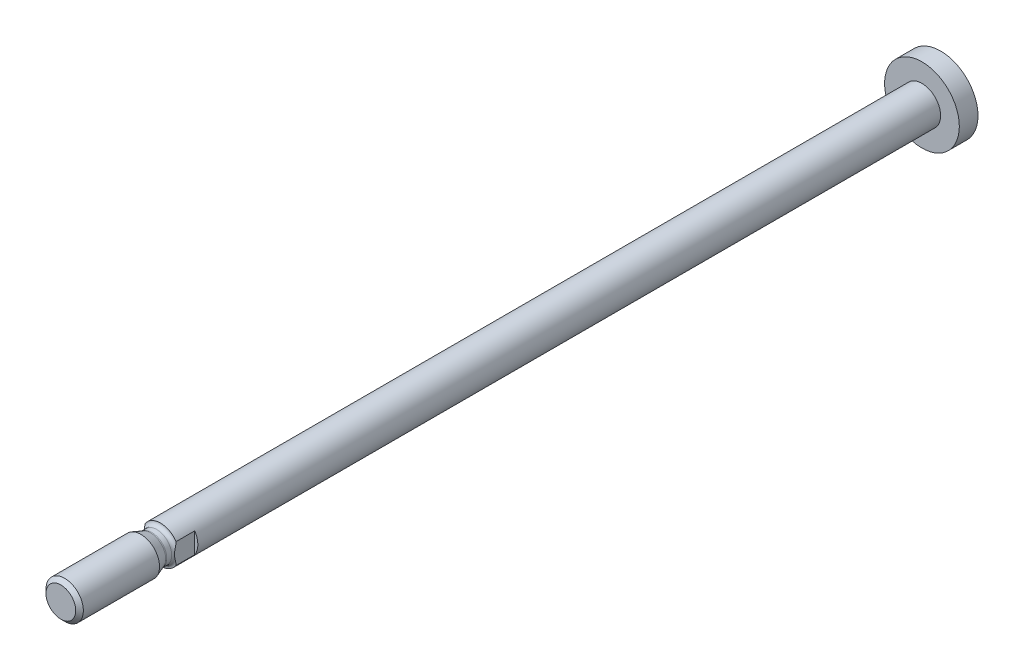
ISO-10303-21;
HEADER;
FILE_DESCRIPTION(('STEP AP214'),'2;1');
FILE_NAME('part.step','',(''),(''),'','','');
FILE_SCHEMA(('AUTOMOTIVE_DESIGN { 1 0 10303 214 1 1 1 1 }'));
ENDSEC;
DATA;
#1=APPLICATION_CONTEXT('core data for automotive mechanical design processes');
#2=APPLICATION_PROTOCOL_DEFINITION('international standard','automotive_design',2000,#1);
#3=PRODUCT_CONTEXT('',#1,'mechanical');
#4=PRODUCT('Part','Part','',(#3));
#5=PRODUCT_RELATED_PRODUCT_CATEGORY('part','',(#4));
#6=PRODUCT_DEFINITION_FORMATION('','',#4);
#7=PRODUCT_DEFINITION_CONTEXT('part definition',#1,'design');
#8=PRODUCT_DEFINITION('design','',#6,#7);
#9=PRODUCT_DEFINITION_SHAPE('','',#8);
#10=(LENGTH_UNIT() NAMED_UNIT(*) SI_UNIT(.MILLI.,.METRE.));
#11=(NAMED_UNIT(*) PLANE_ANGLE_UNIT() SI_UNIT($,.RADIAN.));
#12=(NAMED_UNIT(*) SI_UNIT($,.STERADIAN.) SOLID_ANGLE_UNIT());
#13=UNCERTAINTY_MEASURE_WITH_UNIT(LENGTH_MEASURE(1.E-05),#10,'distance_accuracy_value','');
#14=(GEOMETRIC_REPRESENTATION_CONTEXT(3) GLOBAL_UNCERTAINTY_ASSIGNED_CONTEXT((#13)) GLOBAL_UNIT_ASSIGNED_CONTEXT((#10,
#11,#12)) REPRESENTATION_CONTEXT('',''));
#15=CARTESIAN_POINT('',(0.,0.,0.));
#16=DIRECTION('',(0.,0.,1.));
#17=DIRECTION('',(1.,0.,0.));
#18=AXIS2_PLACEMENT_3D('',#15,#16,#17);
#19=CARTESIAN_POINT('',(0.,0.,-120.3));
#20=DIRECTION('',(0.,0.,1.));
#21=DIRECTION('',(1.,0.,0.));
#22=AXIS2_PLACEMENT_3D('',#19,#20,#21);
#23=CYLINDRICAL_SURFACE('',#22,3.);
#24=CARTESIAN_POINT('',(0.,0.,-117.3));
#25=DIRECTION('',(0.,0.,1.));
#26=DIRECTION('',(1.,0.,0.));
#27=AXIS2_PLACEMENT_3D('',#24,#25,#26);
#28=CIRCLE('',#27,3.);
#29=CARTESIAN_POINT('',(3.,0.,-117.3));
#30=VERTEX_POINT('',#29);
#31=EDGE_CURVE('E129',#30,#30,#28,.T.);
#32=ORIENTED_EDGE('',*,*,#31,.T.);
#33=EDGE_LOOP('',(#32));
#34=FACE_BOUND('',#33,.T.);
#35=DIRECTION('',(0.,0.,1.));
#36=VECTOR('',#35,1.);
#37=CARTESIAN_POINT('',(-2.5,-1.6583123951777,-120.3));
#38=LINE('',#37,#36);
#39=CARTESIAN_POINT('',(-2.5,-1.6583123951777,2.));
#40=VERTEX_POINT('',#39);
#41=CARTESIAN_POINT('',(-2.5,-1.6583123951777,4.99999999999999));
#42=VERTEX_POINT('',#41);
#43=EDGE_CURVE('E59',#40,#42,#38,.T.);
#44=ORIENTED_EDGE('',*,*,#43,.F.);
#45=CARTESIAN_POINT('',(0.,0.,2.));
#46=DIRECTION('',(0.,0.,1.));
#47=DIRECTION('',(1.,0.,0.));
#48=AXIS2_PLACEMENT_3D('',#45,#46,#47);
#49=CIRCLE('',#48,3.);
#50=CARTESIAN_POINT('',(-2.5,1.6583123951777,2.));
#51=VERTEX_POINT('',#50);
#52=EDGE_CURVE('E11',#51,#40,#49,.T.);
#53=ORIENTED_EDGE('',*,*,#52,.F.);
#54=DIRECTION('',(0.,0.,1.));
#55=VECTOR('',#54,1.);
#56=CARTESIAN_POINT('',(-2.5,1.6583123951777,-120.3));
#57=LINE('',#56,#55);
#58=CARTESIAN_POINT('',(-2.5,1.65831239517778,4.99999999999909));
#59=VERTEX_POINT('',#58);
#60=EDGE_CURVE('E99',#59,#51,#57,.F.);
#61=ORIENTED_EDGE('',*,*,#60,.F.);
#62=CARTESIAN_POINT('',(0.,0.,4.99999999999999));
#63=DIRECTION('',(0.,0.,1.));
#64=DIRECTION('',(1.,0.,0.));
#65=AXIS2_PLACEMENT_3D('',#62,#63,#64);
#66=CIRCLE('',#65,3.);
#67=CARTESIAN_POINT('',(2.5,1.6583123951777,4.99999999999999));
#68=VERTEX_POINT('',#67);
#69=EDGE_CURVE('E98',#68,#59,#66,.T.);
#70=ORIENTED_EDGE('',*,*,#69,.F.);
#71=DIRECTION('',(0.,0.,1.));
#72=VECTOR('',#71,1.);
#73=CARTESIAN_POINT('',(2.5,1.6583123951777,-120.3));
#74=LINE('',#73,#72);
#75=CARTESIAN_POINT('',(2.5,1.6583123951777,2.));
#76=VERTEX_POINT('',#75);
#77=EDGE_CURVE('E67',#76,#68,#74,.T.);
#78=ORIENTED_EDGE('',*,*,#77,.F.);
#79=CARTESIAN_POINT('',(2.5,-1.6583123951777,2.));
#80=VERTEX_POINT('',#79);
#81=EDGE_CURVE('E48',#80,#76,#49,.T.);
#82=ORIENTED_EDGE('',*,*,#81,.F.);
#83=DIRECTION('',(0.,0.,1.));
#84=VECTOR('',#83,1.);
#85=CARTESIAN_POINT('',(2.5,-1.6583123951777,-120.3));
#86=LINE('',#85,#84);
#87=CARTESIAN_POINT('',(2.5,-1.65831239517778,4.99999999999909));
#88=VERTEX_POINT('',#87);
#89=EDGE_CURVE('E92',#88,#80,#86,.F.);
#90=ORIENTED_EDGE('',*,*,#89,.F.);
#91=EDGE_CURVE('E132',#42,#88,#66,.T.);
#92=ORIENTED_EDGE('',*,*,#91,.F.);
#93=EDGE_LOOP('',(#44,#53,#61,#70,#78,#82,#90,#92));
#94=FACE_BOUND('',#93,.T.);
#95=ADVANCED_FACE('F45',(#34,#94),#23,.T.);
#96=CARTESIAN_POINT('',(0.,0.,5.6000000000001));
#97=DIRECTION('',(0.,0.,1.));
#98=DIRECTION('',(1.,0.,0.));
#99=AXIS2_PLACEMENT_3D('',#96,#97,#98);
#100=TOROIDAL_SURFACE('',#99,3.0000000000001,0.600000000000099);
#101=CARTESIAN_POINT('',(0.,0.,5.6));
#102=DIRECTION('',(0.,0.,1.));
#103=DIRECTION('',(1.,0.,0.));
#104=AXIS2_PLACEMENT_3D('',#101,#102,#103);
#105=CIRCLE('',#104,2.4);
#106=CARTESIAN_POINT('',(2.4,0.,5.6));
#107=VERTEX_POINT('',#106);
#108=EDGE_CURVE('E120',#107,#107,#105,.T.);
#109=ORIENTED_EDGE('',*,*,#108,.F.);
#110=EDGE_LOOP('',(#109));
#111=FACE_BOUND('',#110,.T.);
#112=CARTESIAN_POINT('',(-2.5,0.,5.26833752096453));
#113=CARTESIAN_POINT('',(-2.5,0.0507234426297441,5.26834839993848));
#114=CARTESIAN_POINT('',(-2.5,0.101441776799662,5.26596843791489));
#115=CARTESIAN_POINT('',(-2.5,0.202536067556288,5.2569952015163));
#116=CARTESIAN_POINT('',(-2.5,0.252911588949165,5.2503973212644));
#117=CARTESIAN_POINT('',(-2.5,0.35392632203634,5.23403658213965));
#118=CARTESIAN_POINT('',(-2.5,0.404557369480025,5.224225913585));
#119=CARTESIAN_POINT('',(-2.5,0.505400398866161,5.20278595137819));
#120=CARTESIAN_POINT('',(-2.5,0.555612509775304,5.1911572409283));
#121=CARTESIAN_POINT('',(-2.5,0.655655613826413,5.16721678219831));
#122=CARTESIAN_POINT('',(-2.5,0.705487327239528,5.15490798008948));
#123=CARTESIAN_POINT('',(-2.5,0.805181864056362,5.13041893752706));
#124=CARTESIAN_POINT('',(-2.5,0.855044688832192,5.11823870324147));
#125=CARTESIAN_POINT('',(-2.5,1.00507376125951,5.08293674920261));
#126=CARTESIAN_POINT('',(-2.5,1.1055660279648,5.06108488117838));
#127=CARTESIAN_POINT('',(-2.5,1.30645493621981,5.02592717471424));
#128=CARTESIAN_POINT('',(-2.5,1.40682678389803,5.01248870030289));
#129=CARTESIAN_POINT('',(-2.5,1.60840199518987,4.99838763017595));
#130=CARTESIAN_POINT('',(-2.5,1.70960094347028,4.99767823287719));
#131=CARTESIAN_POINT('',(-2.5,1.86622781794818,5.01106448653587));
#132=CARTESIAN_POINT('',(-2.5,1.92218137883188,5.01877622049858));
#133=CARTESIAN_POINT('',(-2.5,2.03285053262341,5.0413651074687));
#134=CARTESIAN_POINT('',(-2.5,2.08756307823151,5.05625824117348));
#135=CARTESIAN_POINT('',(-2.5,2.18328084843635,5.09083457513036));
#136=CARTESIAN_POINT('',(-2.5,2.22483950461237,5.10896465354793));
#137=CARTESIAN_POINT('',(-2.5,2.30459524648064,5.1515245306446));
#138=CARTESIAN_POINT('',(-2.5,2.34279989724468,5.17593963670877));
#139=CARTESIAN_POINT('',(-2.5,2.40362753966407,5.22361594487622));
#140=CARTESIAN_POINT('',(-2.5,2.42757076392253,5.24518752529637));
#141=CARTESIAN_POINT('',(-2.5,2.47175757689057,5.29185573262645));
#142=CARTESIAN_POINT('',(-2.5,2.49200531158724,5.31694835263777));
#143=CARTESIAN_POINT('',(-2.5,2.52468492158815,5.36594738678137));
#144=CARTESIAN_POINT('',(-2.5,2.53785643218482,5.38935828111803));
#145=CARTESIAN_POINT('',(-2.5,2.56013164913301,5.43805384411947));
#146=CARTESIAN_POINT('',(-2.5,2.56923737677398,5.46333757440499));
#147=CARTESIAN_POINT('',(-2.5,2.58283057049981,5.51527496834575));
#148=CARTESIAN_POINT('',(-2.5,2.58729356105886,5.54193512227162));
#149=CARTESIAN_POINT('',(-2.5,2.59118020467599,5.59561989324821));
#150=CARTESIAN_POINT('',(-2.5,2.5906054179438,5.62264439487102));
#151=CARTESIAN_POINT('',(-2.5,2.5847447911938,5.67371298536964));
#152=CARTESIAN_POINT('',(-2.5,2.57988467167735,5.69780754958458));
#153=CARTESIAN_POINT('',(-2.5,2.56633022368149,5.74488485425705));
#154=CARTESIAN_POINT('',(-2.5,2.55763543991684,5.76786746233366));
#155=CARTESIAN_POINT('',(-2.5,2.53647695281551,5.81308697753744));
#156=CARTESIAN_POINT('',(-2.5,2.52388217742275,5.83526203314746));
#157=CARTESIAN_POINT('',(-2.5,2.49565831542702,5.87756858678122));
#158=CARTESIAN_POINT('',(-2.5,2.4800283022487,5.897699457906));
#159=CARTESIAN_POINT('',(-2.5,2.4381803160609,5.94494905141413));
#160=CARTESIAN_POINT('',(-2.5,2.41048793322772,5.97076525046522));
#161=CARTESIAN_POINT('',(-2.5,2.35128940318857,6.01762864695372));
#162=CARTESIAN_POINT('',(-2.5,2.31977194494069,6.03866114436212));
#163=CARTESIAN_POINT('',(-2.5,2.23952256294481,6.08463351159361));
#164=CARTESIAN_POINT('',(-2.5,2.18939204577726,6.10711912432076));
#165=CARTESIAN_POINT('',(-2.5,2.086424206848,6.14398267826286));
#166=CARTESIAN_POINT('',(-2.5,2.03358928965091,6.15836768991921));
#167=CARTESIAN_POINT('',(-2.5,1.93599580204544,6.17849484994285));
#168=CARTESIAN_POINT('',(-2.5,1.89144834077192,6.18531116329585));
#169=CARTESIAN_POINT('',(-2.5,1.80189908033616,6.19505697557448));
#170=CARTESIAN_POINT('',(-2.5,1.75689686177072,6.19798247787778));
#171=CARTESIAN_POINT('',(-2.5,1.66646832286127,6.20053377831371));
#172=CARTESIAN_POINT('',(-2.5,1.6210413945456,6.20013412759755));
#173=CARTESIAN_POINT('',(-2.5,1.53034280767568,6.19650595241103));
#174=CARTESIAN_POINT('',(-2.5,1.48507106445849,6.1932793543307));
#175=CARTESIAN_POINT('',(-2.5,1.33918047559004,6.17906735223514));
#176=CARTESIAN_POINT('',(-2.5,1.23902345631669,6.16342028964884));
#177=CARTESIAN_POINT('',(-2.5,1.03994836030368,6.12508984420092));
#178=CARTESIAN_POINT('',(-2.5,0.941034235224376,6.10238806221333));
#179=CARTESIAN_POINT('',(-2.5,0.793509038998567,6.06677672186832));
#180=CARTESIAN_POINT('',(-2.5,0.7446863854637,6.054702575567));
#181=CARTESIAN_POINT('',(-2.5,0.646996290398524,6.030738686552));
#182=CARTESIAN_POINT('',(-2.5,0.598128851070118,6.0188489352388));
#183=CARTESIAN_POINT('',(-2.5,0.500334281886721,5.99617397742217));
#184=CARTESIAN_POINT('',(-2.5,0.451408146263369,5.98538460255591));
#185=CARTESIAN_POINT('',(-2.5,0.353119090508098,5.96594052833405));
#186=CARTESIAN_POINT('',(-2.5,0.303756196305667,5.95728570312374));
#187=CARTESIAN_POINT('',(-2.5,0.204122497966492,5.94328110899502));
#188=CARTESIAN_POINT('',(-2.5,0.153847567097064,5.93795905985694));
#189=CARTESIAN_POINT('',(-2.5,0.0530351286873156,5.93177082830429));
#190=CARTESIAN_POINT('',(-2.5,0.0024977994589948,5.930901937583));
#191=CARTESIAN_POINT('',(-2.5,-0.0985305210715612,5.93381110626722));
#192=CARTESIAN_POINT('',(-2.5,-0.14902123482016,5.93759813511376));
#193=CARTESIAN_POINT('',(-2.5,-0.249573888409545,5.94904126176878));
#194=CARTESIAN_POINT('',(-2.5,-0.299635458091892,5.95670041313862));
#195=CARTESIAN_POINT('',(-2.5,-0.399725252919972,5.97472154484855));
#196=CARTESIAN_POINT('',(-2.5,-0.449748880216866,5.98510788708088));
#197=CARTESIAN_POINT('',(-2.5,-0.549453617514231,6.00732659888942));
#198=CARTESIAN_POINT('',(-2.5,-0.599134785603654,6.01915871651809));
#199=CARTESIAN_POINT('',(-2.5,-0.698392421521691,6.04328051823731));
#200=CARTESIAN_POINT('',(-2.5,-0.747968869022546,6.05557028383309));
#201=CARTESIAN_POINT('',(-2.5,-0.84720464589227,6.07981009984425));
#202=CARTESIAN_POINT('',(-2.5,-0.896863971124109,6.0917601667094));
#203=CARTESIAN_POINT('',(-2.5,-0.975241469303783,6.10978478042876));
#204=CARTESIAN_POINT('',(-2.5,-1.00388150216564,6.11619624816889));
#205=CARTESIAN_POINT('',(-2.5,-1.06125902675178,6.12857195456169));
#206=CARTESIAN_POINT('',(-2.5,-1.08999652018277,6.13453618533974));
#207=CARTESIAN_POINT('',(-2.5,-1.14748265723325,6.1458846074232));
#208=CARTESIAN_POINT('',(-2.5,-1.17623091126653,6.15127075206469));
#209=CARTESIAN_POINT('',(-2.5,-1.23384312688132,6.16137594760793));
#210=CARTESIAN_POINT('',(-2.5,-1.26270708577413,6.16609501391968));
#211=CARTESIAN_POINT('',(-2.5,-1.34949136584038,6.17908804539659));
#212=CARTESIAN_POINT('',(-2.5,-1.40759592627029,6.18619616796949));
#213=CARTESIAN_POINT('',(-2.5,-1.52420669712544,6.19636423685649));
#214=CARTESIAN_POINT('',(-2.5,-1.58271310503325,6.1994220245478));
#215=CARTESIAN_POINT('',(-2.5,-1.70911532678372,6.20051114496721));
#216=CARTESIAN_POINT('',(-2.5,-1.77702602049488,6.19766666103081));
#217=CARTESIAN_POINT('',(-2.5,-1.912149147007,6.18315262249392));
#218=CARTESIAN_POINT('',(-2.5,-1.97936016975703,6.17146782027944));
#219=CARTESIAN_POINT('',(-2.5,-2.09293467910467,6.14162835403314));
#220=CARTESIAN_POINT('',(-2.5,-2.1399801193776,6.12611102431254));
#221=CARTESIAN_POINT('',(-2.5,-2.23116163556241,6.08815370009842));
#222=CARTESIAN_POINT('',(-2.5,-2.27530548479003,6.06573319994486));
#223=CARTESIAN_POINT('',(-2.5,-2.34660579555824,6.0206656653127));
#224=CARTESIAN_POINT('',(-2.5,-2.37498330055351,5.99995880382842));
#225=CARTESIAN_POINT('',(-2.5,-2.42818185419372,5.95435228802646));
#226=CARTESIAN_POINT('',(-2.5,-2.45300628498281,5.92945667074117));
#227=CARTESIAN_POINT('',(-2.5,-2.49337206402375,5.88080957286876));
#228=CARTESIAN_POINT('',(-2.5,-2.50977972671913,5.85778028891266));
#229=CARTESIAN_POINT('',(-2.5,-2.5385948801776,5.80932543735906));
#230=CARTESIAN_POINT('',(-2.5,-2.55100468980703,5.7839012699618));
#231=CARTESIAN_POINT('',(-2.5,-2.57111606880391,5.7310152189761));
#232=CARTESIAN_POINT('',(-2.5,-2.57878240755407,5.70353974708557));
#233=CARTESIAN_POINT('',(-2.5,-2.58865812747843,5.64762323062993));
#234=CARTESIAN_POINT('',(-2.5,-2.59087093912576,5.61918280447873));
#235=CARTESIAN_POINT('',(-2.5,-2.58974032110845,5.56589468768046));
#236=CARTESIAN_POINT('',(-2.5,-2.58704036062141,5.54103102121321));
#237=CARTESIAN_POINT('',(-2.5,-2.57748265423562,5.49212434637714));
#238=CARTESIAN_POINT('',(-2.5,-2.57062518368025,5.46808128377277));
#239=CARTESIAN_POINT('',(-2.5,-2.55318309970271,5.42147694109437));
#240=CARTESIAN_POINT('',(-2.5,-2.54260847384664,5.39891188066154));
#241=CARTESIAN_POINT('',(-2.5,-2.51826231502416,5.35558968714916));
#242=CARTESIAN_POINT('',(-2.5,-2.50448933519591,5.33483337816906));
#243=CARTESIAN_POINT('',(-2.5,-2.46797257111134,5.28708275256527));
#244=CARTESIAN_POINT('',(-2.5,-2.44388663659998,5.26111270404154));
#245=CARTESIAN_POINT('',(-2.5,-2.39183121173732,5.21341702762138));
#246=CARTESIAN_POINT('',(-2.5,-2.36385414462067,5.19169988455002));
#247=CARTESIAN_POINT('',(-2.5,-2.29309604385226,5.14424955817408));
#248=CARTESIAN_POINT('',(-2.5,-2.24896151787955,5.12054273771195));
#249=CARTESIAN_POINT('',(-2.5,-2.15755724893995,5.08032986787273));
#250=CARTESIAN_POINT('',(-2.5,-2.1102815253453,5.0638380357592));
#251=CARTESIAN_POINT('',(-2.5,-1.98539576167196,5.02901994971649));
#252=CARTESIAN_POINT('',(-2.5,-1.90647682078743,5.01544295171964));
#253=CARTESIAN_POINT('',(-2.5,-1.74768813149434,5.00017484346382));
#254=CARTESIAN_POINT('',(-2.5,-1.66781762927049,4.99849388464395));
#255=CARTESIAN_POINT('',(-2.5,-1.45429321635247,5.00579419289827));
#256=CARTESIAN_POINT('',(-2.5,-1.32097329964418,5.02279704607492));
#257=CARTESIAN_POINT('',(-2.5,-1.12273292987174,5.05843900515103));
#258=CARTESIAN_POINT('',(-2.5,-1.05669317759064,5.07208123732001));
#259=CARTESIAN_POINT('',(-2.5,-0.925080173294097,5.10144856377507));
#260=CARTESIAN_POINT('',(-2.5,-0.85950678696237,5.11717303045709));
#261=CARTESIAN_POINT('',(-2.5,-0.728157455724953,5.14928145287764));
#262=CARTESIAN_POINT('',(-2.5,-0.662382356378558,5.16566853749943));
#263=CARTESIAN_POINT('',(-2.5,-0.530451230737349,5.19710748690057));
#264=CARTESIAN_POINT('',(-2.5,-0.46429498692756,5.21215848739435));
#265=CARTESIAN_POINT('',(-2.5,-0.332137198799993,5.23811298682939));
#266=CARTESIAN_POINT('',(-2.5,-0.266147995614798,5.24907485812429));
#267=CARTESIAN_POINT('',(-2.5,-0.13343508853748,5.26417313941374));
#268=CARTESIAN_POINT('',(-2.5,-0.0667131258677896,5.26832321258322));
#269=CARTESIAN_POINT('',(-2.5,0.,5.26833752096453));
#270=B_SPLINE_CURVE_WITH_KNOTS('',3,(#112,#113,#114,#115,#116,#117,#118,#119,#120,#121,#122,
#123,#124,#125,#126,#127,#128,#129,#130,#131,#132,#133,#134,#135,#136,#137,#138,#139,#140,#141,
#142,#143,#144,#145,#146,#147,#148,#149,#150,#151,#152,#153,#154,#155,#156,#157,#158,#159,#160,
#161,#162,#163,#164,#165,#166,#167,#168,#169,#170,#171,#172,#173,#174,#175,#176,#177,#178,#179,
#180,#181,#182,#183,#184,#185,#186,#187,#188,#189,#190,#191,#192,#193,#194,#195,#196,#197,#198,
#199,#200,#201,#202,#203,#204,#205,#206,#207,#208,#209,#210,#211,#212,#213,#214,#215,#216,#217,
#218,#219,#220,#221,#222,#223,#224,#225,#226,#227,#228,#229,#230,#231,#232,#233,#234,#235,#236,
#237,#238,#239,#240,#241,#242,#243,#244,#245,#246,#247,#248,#249,#250,#251,#252,#253,#254,#255,
#256,#257,#258,#259,#260,#261,#262,#263,#264,#265,#266,#267,#268,#269),.UNSPECIFIED.,.T.,.F.,(4,
2,2,2,2,2,2,2,2,2,2,2,2,2,2,2,2,2,2,2,2,2,2,2,2,2,2,2,2,2,2,2,2,2,2,2,2,2,2,2,2,2,2,2,2,2,2,2,2,
2,2,2,2,2,2,2,2,2,2,2,2,2,2,2,2,2,2,2,2,2,2,2,2,2,2,2,2,2,4),(0.,0.152115749462961,
0.304397890479205,0.459057777660119,0.613668153537359,0.76765452052503,0.921648241698668,
1.22999186740174,1.53334327295527,1.83557910296654,2.00468122496769,2.17416139710525,
2.30975526259906,2.44503498191611,2.54138706790922,2.63763038250484,2.71788414225495,
2.79809795959123,2.87873253660465,2.95934214181033,3.03274594433316,3.10615846435156,
3.18237030946167,3.25860545664829,3.37154774885102,3.48483255287211,3.64874326809032,
3.81251069461259,3.94751849926572,4.08266487644991,4.21884653384819,4.35493546397263,
4.65852821936571,4.96291950372185,5.11380283698696,5.2646791123006,5.41496078164642,
5.56523358814694,5.71674021710462,5.86815469233289,6.01986131905259,6.17168776888823,
6.3249195654772,6.47812469716163,6.63135724578266,6.7845823615018,6.87262624262423,
6.9606716735928,7.04840955727845,7.13614541382411,7.31164210225534,7.487232283928,
7.69072100095721,7.89456149389004,8.04275027379228,8.1905243529531,8.29556794817655,
8.40051087855684,8.48500651711341,8.56945305722983,8.65451949621374,8.73953241154295,
8.81419843639983,8.88885951681877,8.96332150589878,9.03781724571823,9.14348655987521,
9.24936459025057,9.39882327642183,9.54857516145059,9.78744806917548,10.0265247936209,
10.4280628477144,10.630387719692,10.8326517473681,11.0360188284461,11.239516519211,
11.439986712254,11.6400543065313),.UNSPECIFIED.);
#271=EDGE_CURVE('E90',#42,#59,#270,.T.);
#272=ORIENTED_EDGE('',*,*,#271,.F.);
#273=ORIENTED_EDGE('',*,*,#91,.T.);
#274=CARTESIAN_POINT('',(2.5,0.,5.26833752096453));
#275=CARTESIAN_POINT('',(2.5,-0.0507234426297441,5.26834839993848));
#276=CARTESIAN_POINT('',(2.5,-0.101441776799662,5.26596843791489));
#277=CARTESIAN_POINT('',(2.5,-0.202536067556288,5.2569952015163));
#278=CARTESIAN_POINT('',(2.5,-0.252911588949165,5.2503973212644));
#279=CARTESIAN_POINT('',(2.5,-0.35392632203634,5.23403658213965));
#280=CARTESIAN_POINT('',(2.5,-0.404557369480025,5.224225913585));
#281=CARTESIAN_POINT('',(2.5,-0.505400398866161,5.20278595137819));
#282=CARTESIAN_POINT('',(2.5,-0.555612509775304,5.1911572409283));
#283=CARTESIAN_POINT('',(2.5,-0.655655613826413,5.16721678219831));
#284=CARTESIAN_POINT('',(2.5,-0.705487327239528,5.15490798008948));
#285=CARTESIAN_POINT('',(2.5,-0.805181864056362,5.13041893752706));
#286=CARTESIAN_POINT('',(2.5,-0.855044688832192,5.11823870324147));
#287=CARTESIAN_POINT('',(2.5,-1.00507376125951,5.08293674920261));
#288=CARTESIAN_POINT('',(2.5,-1.1055660279648,5.06108488117838));
#289=CARTESIAN_POINT('',(2.5,-1.30645493621981,5.02592717471424));
#290=CARTESIAN_POINT('',(2.5,-1.40682678389803,5.01248870030289));
#291=CARTESIAN_POINT('',(2.5,-1.60840199518987,4.99838763017595));
#292=CARTESIAN_POINT('',(2.5,-1.70960094347028,4.99767823287719));
#293=CARTESIAN_POINT('',(2.5,-1.86622781794818,5.01106448653587));
#294=CARTESIAN_POINT('',(2.5,-1.92218137883188,5.01877622049858));
#295=CARTESIAN_POINT('',(2.5,-2.03285053262341,5.0413651074687));
#296=CARTESIAN_POINT('',(2.5,-2.08756307823151,5.05625824117348));
#297=CARTESIAN_POINT('',(2.5,-2.18328084843635,5.09083457513036));
#298=CARTESIAN_POINT('',(2.5,-2.22483950461237,5.10896465354793));
#299=CARTESIAN_POINT('',(2.5,-2.30459524648064,5.1515245306446));
#300=CARTESIAN_POINT('',(2.5,-2.34279989724468,5.17593963670877));
#301=CARTESIAN_POINT('',(2.5,-2.40362753966407,5.22361594487622));
#302=CARTESIAN_POINT('',(2.5,-2.42757076392253,5.24518752529637));
#303=CARTESIAN_POINT('',(2.5,-2.47175757689057,5.29185573262645));
#304=CARTESIAN_POINT('',(2.5,-2.49200531158724,5.31694835263777));
#305=CARTESIAN_POINT('',(2.5,-2.52468492158815,5.36594738678137));
#306=CARTESIAN_POINT('',(2.5,-2.53785643218482,5.38935828111803));
#307=CARTESIAN_POINT('',(2.5,-2.56013164913301,5.43805384411947));
#308=CARTESIAN_POINT('',(2.5,-2.56923737677398,5.46333757440499));
#309=CARTESIAN_POINT('',(2.5,-2.58283057049981,5.51527496834575));
#310=CARTESIAN_POINT('',(2.5,-2.58729356105886,5.54193512227162));
#311=CARTESIAN_POINT('',(2.5,-2.59118020467599,5.59561989324821));
#312=CARTESIAN_POINT('',(2.5,-2.5906054179438,5.62264439487102));
#313=CARTESIAN_POINT('',(2.5,-2.5847447911938,5.67371298536964));
#314=CARTESIAN_POINT('',(2.5,-2.57988467167735,5.69780754958458));
#315=CARTESIAN_POINT('',(2.5,-2.56633022368149,5.74488485425705));
#316=CARTESIAN_POINT('',(2.5,-2.55763543991684,5.76786746233366));
#317=CARTESIAN_POINT('',(2.5,-2.53647695281551,5.81308697753744));
#318=CARTESIAN_POINT('',(2.5,-2.52388217742275,5.83526203314746));
#319=CARTESIAN_POINT('',(2.5,-2.49565831542702,5.87756858678122));
#320=CARTESIAN_POINT('',(2.5,-2.4800283022487,5.897699457906));
#321=CARTESIAN_POINT('',(2.5,-2.4381803160609,5.94494905141413));
#322=CARTESIAN_POINT('',(2.5,-2.41048793322772,5.97076525046522));
#323=CARTESIAN_POINT('',(2.5,-2.35128940318857,6.01762864695372));
#324=CARTESIAN_POINT('',(2.5,-2.31977194494069,6.03866114436212));
#325=CARTESIAN_POINT('',(2.5,-2.23952256294481,6.08463351159361));
#326=CARTESIAN_POINT('',(2.5,-2.18939204577726,6.10711912432076));
#327=CARTESIAN_POINT('',(2.5,-2.086424206848,6.14398267826286));
#328=CARTESIAN_POINT('',(2.5,-2.03358928965091,6.15836768991921));
#329=CARTESIAN_POINT('',(2.5,-1.93599580204544,6.17849484994285));
#330=CARTESIAN_POINT('',(2.5,-1.89144834077192,6.18531116329585));
#331=CARTESIAN_POINT('',(2.5,-1.80189908033616,6.19505697557448));
#332=CARTESIAN_POINT('',(2.5,-1.75689686177072,6.19798247787778));
#333=CARTESIAN_POINT('',(2.5,-1.66646832286127,6.20053377831371));
#334=CARTESIAN_POINT('',(2.5,-1.6210413945456,6.20013412759755));
#335=CARTESIAN_POINT('',(2.5,-1.53034280767568,6.19650595241103));
#336=CARTESIAN_POINT('',(2.5,-1.48507106445849,6.1932793543307));
#337=CARTESIAN_POINT('',(2.5,-1.33918047559004,6.17906735223514));
#338=CARTESIAN_POINT('',(2.5,-1.23902345631669,6.16342028964884));
#339=CARTESIAN_POINT('',(2.5,-1.03994836030368,6.12508984420092));
#340=CARTESIAN_POINT('',(2.5,-0.941034235224376,6.10238806221333));
#341=CARTESIAN_POINT('',(2.5,-0.793509038998567,6.06677672186832));
#342=CARTESIAN_POINT('',(2.5,-0.7446863854637,6.054702575567));
#343=CARTESIAN_POINT('',(2.5,-0.646996290398524,6.030738686552));
#344=CARTESIAN_POINT('',(2.5,-0.598128851070118,6.0188489352388));
#345=CARTESIAN_POINT('',(2.5,-0.500334281886721,5.99617397742217));
#346=CARTESIAN_POINT('',(2.5,-0.451408146263369,5.98538460255591));
#347=CARTESIAN_POINT('',(2.5,-0.353119090508098,5.96594052833405));
#348=CARTESIAN_POINT('',(2.5,-0.303756196305667,5.95728570312374));
#349=CARTESIAN_POINT('',(2.5,-0.204122497966492,5.94328110899502));
#350=CARTESIAN_POINT('',(2.5,-0.153847567097064,5.93795905985694));
#351=CARTESIAN_POINT('',(2.5,-0.0530351286873156,5.93177082830429));
#352=CARTESIAN_POINT('',(2.5,-0.0024977994589948,5.930901937583));
#353=CARTESIAN_POINT('',(2.5,0.0985305210715612,5.93381110626722));
#354=CARTESIAN_POINT('',(2.5,0.14902123482016,5.93759813511376));
#355=CARTESIAN_POINT('',(2.5,0.249573888409545,5.94904126176878));
#356=CARTESIAN_POINT('',(2.5,0.299635458091892,5.95670041313862));
#357=CARTESIAN_POINT('',(2.5,0.399725252919972,5.97472154484855));
#358=CARTESIAN_POINT('',(2.5,0.449748880216866,5.98510788708088));
#359=CARTESIAN_POINT('',(2.5,0.549453617514231,6.00732659888942));
#360=CARTESIAN_POINT('',(2.5,0.599134785603654,6.01915871651809));
#361=CARTESIAN_POINT('',(2.5,0.698392421521691,6.04328051823731));
#362=CARTESIAN_POINT('',(2.5,0.747968869022546,6.05557028383309));
#363=CARTESIAN_POINT('',(2.5,0.84720464589227,6.07981009984425));
#364=CARTESIAN_POINT('',(2.5,0.896863971124109,6.0917601667094));
#365=CARTESIAN_POINT('',(2.5,0.975241469303783,6.10978478042876));
#366=CARTESIAN_POINT('',(2.5,1.00388150216564,6.11619624816889));
#367=CARTESIAN_POINT('',(2.5,1.06125902675178,6.12857195456169));
#368=CARTESIAN_POINT('',(2.5,1.08999652018277,6.13453618533974));
#369=CARTESIAN_POINT('',(2.5,1.14748265723325,6.1458846074232));
#370=CARTESIAN_POINT('',(2.5,1.17623091126653,6.15127075206469));
#371=CARTESIAN_POINT('',(2.5,1.23384312688132,6.16137594760793));
#372=CARTESIAN_POINT('',(2.5,1.26270708577413,6.16609501391968));
#373=CARTESIAN_POINT('',(2.5,1.34949136584038,6.17908804539659));
#374=CARTESIAN_POINT('',(2.5,1.40759592627029,6.18619616796949));
#375=CARTESIAN_POINT('',(2.5,1.52420669712544,6.19636423685649));
#376=CARTESIAN_POINT('',(2.5,1.58271310503325,6.1994220245478));
#377=CARTESIAN_POINT('',(2.5,1.70911532678372,6.20051114496721));
#378=CARTESIAN_POINT('',(2.5,1.77702602049488,6.19766666103081));
#379=CARTESIAN_POINT('',(2.5,1.912149147007,6.18315262249392));
#380=CARTESIAN_POINT('',(2.5,1.97936016975703,6.17146782027944));
#381=CARTESIAN_POINT('',(2.5,2.09293467910467,6.14162835403314));
#382=CARTESIAN_POINT('',(2.5,2.1399801193776,6.12611102431254));
#383=CARTESIAN_POINT('',(2.5,2.23116163556241,6.08815370009842));
#384=CARTESIAN_POINT('',(2.5,2.27530548479003,6.06573319994486));
#385=CARTESIAN_POINT('',(2.5,2.34660579555824,6.0206656653127));
#386=CARTESIAN_POINT('',(2.5,2.37498330055351,5.99995880382842));
#387=CARTESIAN_POINT('',(2.5,2.42818185419372,5.95435228802646));
#388=CARTESIAN_POINT('',(2.5,2.45300628498281,5.92945667074117));
#389=CARTESIAN_POINT('',(2.5,2.49337206402375,5.88080957286876));
#390=CARTESIAN_POINT('',(2.5,2.50977972671913,5.85778028891266));
#391=CARTESIAN_POINT('',(2.5,2.5385948801776,5.80932543735906));
#392=CARTESIAN_POINT('',(2.5,2.55100468980703,5.7839012699618));
#393=CARTESIAN_POINT('',(2.5,2.57111606880391,5.7310152189761));
#394=CARTESIAN_POINT('',(2.5,2.57878240755407,5.70353974708557));
#395=CARTESIAN_POINT('',(2.5,2.58865812747843,5.64762323062993));
#396=CARTESIAN_POINT('',(2.5,2.59087093912576,5.61918280447873));
#397=CARTESIAN_POINT('',(2.5,2.58974032110845,5.56589468768046));
#398=CARTESIAN_POINT('',(2.5,2.58704036062141,5.54103102121321));
#399=CARTESIAN_POINT('',(2.5,2.57748265423562,5.49212434637714));
#400=CARTESIAN_POINT('',(2.5,2.57062518368025,5.46808128377277));
#401=CARTESIAN_POINT('',(2.5,2.55318309970271,5.42147694109437));
#402=CARTESIAN_POINT('',(2.5,2.54260847384664,5.39891188066154));
#403=CARTESIAN_POINT('',(2.5,2.51826231502416,5.35558968714916));
#404=CARTESIAN_POINT('',(2.5,2.50448933519591,5.33483337816906));
#405=CARTESIAN_POINT('',(2.5,2.46797257111134,5.28708275256527));
#406=CARTESIAN_POINT('',(2.5,2.44388663659998,5.26111270404154));
#407=CARTESIAN_POINT('',(2.5,2.39183121173732,5.21341702762138));
#408=CARTESIAN_POINT('',(2.5,2.36385414462067,5.19169988455002));
#409=CARTESIAN_POINT('',(2.5,2.29309604385226,5.14424955817408));
#410=CARTESIAN_POINT('',(2.5,2.24896151787955,5.12054273771195));
#411=CARTESIAN_POINT('',(2.5,2.15755724893995,5.08032986787273));
#412=CARTESIAN_POINT('',(2.5,2.1102815253453,5.0638380357592));
#413=CARTESIAN_POINT('',(2.5,1.98539576167196,5.02901994971649));
#414=CARTESIAN_POINT('',(2.5,1.90647682078743,5.01544295171964));
#415=CARTESIAN_POINT('',(2.5,1.74768813149434,5.00017484346382));
#416=CARTESIAN_POINT('',(2.5,1.66781762927049,4.99849388464395));
#417=CARTESIAN_POINT('',(2.5,1.45429321635247,5.00579419289827));
#418=CARTESIAN_POINT('',(2.5,1.32097329964418,5.02279704607492));
#419=CARTESIAN_POINT('',(2.5,1.12273292987174,5.05843900515103));
#420=CARTESIAN_POINT('',(2.5,1.05669317759064,5.07208123732001));
#421=CARTESIAN_POINT('',(2.5,0.925080173294097,5.10144856377507));
#422=CARTESIAN_POINT('',(2.5,0.85950678696237,5.11717303045709));
#423=CARTESIAN_POINT('',(2.5,0.728157455724953,5.14928145287764));
#424=CARTESIAN_POINT('',(2.5,0.662382356378558,5.16566853749943));
#425=CARTESIAN_POINT('',(2.5,0.530451230737349,5.19710748690057));
#426=CARTESIAN_POINT('',(2.5,0.46429498692756,5.21215848739435));
#427=CARTESIAN_POINT('',(2.5,0.332137198799993,5.23811298682939));
#428=CARTESIAN_POINT('',(2.5,0.266147995614798,5.24907485812429));
#429=CARTESIAN_POINT('',(2.5,0.13343508853748,5.26417313941374));
#430=CARTESIAN_POINT('',(2.5,0.0667131258677896,5.26832321258322));
#431=CARTESIAN_POINT('',(2.5,0.,5.26833752096453));
#432=B_SPLINE_CURVE_WITH_KNOTS('',3,(#274,#275,#276,#277,#278,#279,#280,#281,#282,#283,#284,
#285,#286,#287,#288,#289,#290,#291,#292,#293,#294,#295,#296,#297,#298,#299,#300,#301,#302,#303,
#304,#305,#306,#307,#308,#309,#310,#311,#312,#313,#314,#315,#316,#317,#318,#319,#320,#321,#322,
#323,#324,#325,#326,#327,#328,#329,#330,#331,#332,#333,#334,#335,#336,#337,#338,#339,#340,#341,
#342,#343,#344,#345,#346,#347,#348,#349,#350,#351,#352,#353,#354,#355,#356,#357,#358,#359,#360,
#361,#362,#363,#364,#365,#366,#367,#368,#369,#370,#371,#372,#373,#374,#375,#376,#377,#378,#379,
#380,#381,#382,#383,#384,#385,#386,#387,#388,#389,#390,#391,#392,#393,#394,#395,#396,#397,#398,
#399,#400,#401,#402,#403,#404,#405,#406,#407,#408,#409,#410,#411,#412,#413,#414,#415,#416,#417,
#418,#419,#420,#421,#422,#423,#424,#425,#426,#427,#428,#429,#430,#431),.UNSPECIFIED.,.T.,.F.,(4,
2,2,2,2,2,2,2,2,2,2,2,2,2,2,2,2,2,2,2,2,2,2,2,2,2,2,2,2,2,2,2,2,2,2,2,2,2,2,2,2,2,2,2,2,2,2,2,2,
2,2,2,2,2,2,2,2,2,2,2,2,2,2,2,2,2,2,2,2,2,2,2,2,2,2,2,2,2,4),(0.,0.152115749462961,
0.304397890479205,0.459057777660119,0.613668153537359,0.76765452052503,0.921648241698668,
1.22999186740174,1.53334327295527,1.83557910296654,2.00468122496769,2.17416139710525,
2.30975526259906,2.44503498191611,2.54138706790922,2.63763038250484,2.71788414225495,
2.79809795959123,2.87873253660465,2.95934214181033,3.03274594433316,3.10615846435156,
3.18237030946167,3.25860545664829,3.37154774885102,3.48483255287211,3.64874326809032,
3.81251069461259,3.94751849926572,4.08266487644991,4.21884653384819,4.35493546397263,
4.65852821936571,4.96291950372185,5.11380283698696,5.2646791123006,5.41496078164642,
5.56523358814694,5.71674021710462,5.86815469233289,6.01986131905259,6.17168776888823,
6.3249195654772,6.47812469716163,6.63135724578266,6.7845823615018,6.87262624262423,
6.9606716735928,7.04840955727845,7.13614541382411,7.31164210225534,7.487232283928,
7.69072100095721,7.89456149389004,8.04275027379228,8.1905243529531,8.29556794817655,
8.40051087855684,8.48500651711341,8.56945305722983,8.65451949621374,8.73953241154295,
8.81419843639983,8.88885951681877,8.96332150589878,9.03781724571823,9.14348655987521,
9.24936459025057,9.39882327642183,9.54857516145059,9.78744806917548,10.0265247936209,
10.4280628477144,10.630387719692,10.8326517473681,11.0360188284461,11.239516519211,
11.439986712254,11.6400543065313),.UNSPECIFIED.);
#433=EDGE_CURVE('E134',#68,#88,#432,.T.);
#434=ORIENTED_EDGE('',*,*,#433,.F.);
#435=ORIENTED_EDGE('',*,*,#69,.T.);
#436=EDGE_LOOP('',(#272,#273,#434,#435));
#437=FACE_BOUND('',#436,.T.);
#438=ADVANCED_FACE('F144',(#111,#437),#100,.F.);
#439=CARTESIAN_POINT('',(0.,3.,-117.3));
#440=DIRECTION('',(0.,0.,-1.));
#441=DIRECTION('',(-1.,0.,0.));
#442=AXIS2_PLACEMENT_3D('',#439,#440,#441);
#443=PLANE('',#442);
#444=ORIENTED_EDGE('',*,*,#31,.F.);
#445=EDGE_LOOP('',(#444));
#446=FACE_BOUND('',#445,.T.);
#447=CARTESIAN_POINT('',(0.,0.,-117.3));
#448=DIRECTION('',(0.,0.,1.));
#449=DIRECTION('',(1.,0.,0.));
#450=AXIS2_PLACEMENT_3D('',#447,#448,#449);
#451=CIRCLE('',#450,6.);
#452=CARTESIAN_POINT('',(6.,0.,-117.3));
#453=VERTEX_POINT('',#452);
#454=EDGE_CURVE('E126',#453,#453,#451,.T.);
#455=ORIENTED_EDGE('',*,*,#454,.T.);
#456=EDGE_LOOP('',(#455));
#457=FACE_BOUND('',#456,.T.);
#458=ADVANCED_FACE('F193',(#446,#457),#443,.F.);
#459=CARTESIAN_POINT('',(0.,0.,-120.3));
#460=DIRECTION('',(0.,0.,1.));
#461=DIRECTION('',(1.,0.,0.));
#462=AXIS2_PLACEMENT_3D('',#459,#460,#461);
#463=CYLINDRICAL_SURFACE('',#462,6.);
#464=ORIENTED_EDGE('',*,*,#454,.F.);
#465=EDGE_LOOP('',(#464));
#466=FACE_BOUND('',#465,.T.);
#467=CARTESIAN_POINT('',(0.,0.,-120.3));
#468=DIRECTION('',(0.,0.,1.));
#469=DIRECTION('',(1.,0.,0.));
#470=AXIS2_PLACEMENT_3D('',#467,#468,#469);
#471=CIRCLE('',#470,6.);
#472=CARTESIAN_POINT('',(6.,0.,-120.3));
#473=VERTEX_POINT('',#472);
#474=EDGE_CURVE('E123',#473,#473,#471,.T.);
#475=ORIENTED_EDGE('',*,*,#474,.T.);
#476=EDGE_LOOP('',(#475));
#477=FACE_BOUND('',#476,.T.);
#478=ADVANCED_FACE('F184',(#466,#477),#463,.T.);
#479=CARTESIAN_POINT('',(0.,6.,-120.3));
#480=DIRECTION('',(0.,0.,1.));
#481=DIRECTION('',(1.,0.,0.));
#482=AXIS2_PLACEMENT_3D('',#479,#480,#481);
#483=PLANE('',#482);
#484=ORIENTED_EDGE('',*,*,#474,.F.);
#485=EDGE_LOOP('',(#484));
#486=FACE_BOUND('',#485,.T.);
#487=ADVANCED_FACE('F177',(#486),#483,.F.);
#488=CARTESIAN_POINT('',(0.,0.,4.));
#489=DIRECTION('',(0.,0.,1.));
#490=DIRECTION('',(1.,0.,0.));
#491=AXIS2_PLACEMENT_3D('',#488,#489,#490);
#492=CYLINDRICAL_SURFACE('',#491,2.4);
#493=CARTESIAN_POINT('',(0.,0.,6.3942038115749));
#494=DIRECTION('',(0.,0.,1.));
#495=DIRECTION('',(1.,0.,0.));
#496=AXIS2_PLACEMENT_3D('',#493,#494,#495);
#497=CIRCLE('',#496,2.4);
#498=CARTESIAN_POINT('',(2.4,0.,6.3942038115749));
#499=VERTEX_POINT('',#498);
#500=EDGE_CURVE('E117',#499,#499,#497,.T.);
#501=ORIENTED_EDGE('',*,*,#500,.F.);
#502=EDGE_LOOP('',(#501));
#503=FACE_BOUND('',#502,.T.);
#504=ORIENTED_EDGE('',*,*,#108,.T.);
#505=EDGE_LOOP('',(#504));
#506=FACE_BOUND('',#505,.T.);
#507=ADVANCED_FACE('F174',(#503,#506),#492,.T.);
#508=CARTESIAN_POINT('',(0.,0.,6.39420381157482));
#509=DIRECTION('',(0.,0.,1.));
#510=DIRECTION('',(1.,0.,0.));
#511=AXIS2_PLACEMENT_3D('',#508,#509,#510);
#512=TOROIDAL_SURFACE('',#511,2.99999999999972,0.599999999999719);
#513=CARTESIAN_POINT('',(0.,0.,6.5994158975703));
#514=DIRECTION('',(0.,0.,1.));
#515=DIRECTION('',(1.,0.,0.));
#516=AXIS2_PLACEMENT_3D('',#513,#514,#515);
#517=CIRCLE('',#516,2.4361844275285);
#518=CARTESIAN_POINT('',(2.4361844275285,0.,6.5994158975703));
#519=VERTEX_POINT('',#518);
#520=EDGE_CURVE('E114',#519,#519,#517,.T.);
#521=ORIENTED_EDGE('',*,*,#520,.F.);
#522=EDGE_LOOP('',(#521));
#523=FACE_BOUND('',#522,.T.);
#524=ORIENTED_EDGE('',*,*,#500,.T.);
#525=EDGE_LOOP('',(#524));
#526=FACE_BOUND('',#525,.T.);
#527=ADVANCED_FACE('F171',(#523,#526),#512,.F.);
#528=CARTESIAN_POINT('',(0.,0.,6.5994158975703));
#529=DIRECTION('',(0.,0.,1.));
#530=DIRECTION('',(1.,0.,0.));
#531=AXIS2_PLACEMENT_3D('',#528,#529,#530);
#532=CONICAL_SURFACE('',#531,2.4361844275285,0.34906585039883);
#533=CARTESIAN_POINT('',(0.,0.,8.1484864516728));
#534=DIRECTION('',(0.,0.,1.));
#535=DIRECTION('',(1.,0.,0.));
#536=AXIS2_PLACEMENT_3D('',#533,#534,#535);
#537=CIRCLE('',#536,3.);
#538=CARTESIAN_POINT('',(3.,0.,8.1484864516728));
#539=VERTEX_POINT('',#538);
#540=EDGE_CURVE('E111',#539,#539,#537,.T.);
#541=ORIENTED_EDGE('',*,*,#540,.F.);
#542=EDGE_LOOP('',(#541));
#543=FACE_BOUND('',#542,.T.);
#544=ORIENTED_EDGE('',*,*,#520,.T.);
#545=EDGE_LOOP('',(#544));
#546=FACE_BOUND('',#545,.T.);
#547=ADVANCED_FACE('F167',(#543,#546),#532,.T.);
#548=CARTESIAN_POINT('',(0.,0.,4.));
#549=DIRECTION('',(0.,0.,1.));
#550=DIRECTION('',(1.,0.,0.));
#551=AXIS2_PLACEMENT_3D('',#548,#549,#550);
#552=CYLINDRICAL_SURFACE('',#551,3.);
#553=CARTESIAN_POINT('',(0.,0.,20.3865));
#554=DIRECTION('',(0.,0.,1.));
#555=DIRECTION('',(1.,0.,0.));
#556=AXIS2_PLACEMENT_3D('',#553,#554,#555);
#557=CIRCLE('',#556,3.);
#558=CARTESIAN_POINT('',(3.,0.,20.3865));
#559=VERTEX_POINT('',#558);
#560=EDGE_CURVE('E108',#559,#559,#557,.T.);
#561=ORIENTED_EDGE('',*,*,#560,.F.);
#562=EDGE_LOOP('',(#561));
#563=FACE_BOUND('',#562,.T.);
#564=ORIENTED_EDGE('',*,*,#540,.T.);
#565=EDGE_LOOP('',(#564));
#566=FACE_BOUND('',#565,.T.);
#567=ADVANCED_FACE('F163',(#563,#566),#552,.T.);
#568=CARTESIAN_POINT('',(0.,0.,20.3865));
#569=DIRECTION('',(0.,0.,-1.));
#570=DIRECTION('',(-1.,0.,0.));
#571=AXIS2_PLACEMENT_3D('',#568,#569,#570);
#572=CONICAL_SURFACE('',#571,3.,0.785398163397449);
#573=CARTESIAN_POINT('',(0.,0.,21.));
#574=DIRECTION('',(0.,0.,1.));
#575=DIRECTION('',(1.,0.,0.));
#576=AXIS2_PLACEMENT_3D('',#573,#574,#575);
#577=CIRCLE('',#576,2.3865);
#578=CARTESIAN_POINT('',(2.3865,0.,21.));
#579=VERTEX_POINT('',#578);
#580=EDGE_CURVE('E105',#579,#579,#577,.T.);
#581=ORIENTED_EDGE('',*,*,#580,.F.);
#582=EDGE_LOOP('',(#581));
#583=FACE_BOUND('',#582,.T.);
#584=ORIENTED_EDGE('',*,*,#560,.T.);
#585=EDGE_LOOP('',(#584));
#586=FACE_BOUND('',#585,.T.);
#587=ADVANCED_FACE('F159',(#583,#586),#572,.T.);
#588=CARTESIAN_POINT('',(0.,0.,21.));
#589=DIRECTION('',(0.,0.,-1.));
#590=DIRECTION('',(-1.,0.,0.));
#591=AXIS2_PLACEMENT_3D('',#588,#589,#590);
#592=PLANE('',#591);
#593=ORIENTED_EDGE('',*,*,#580,.T.);
#594=EDGE_LOOP('',(#593));
#595=FACE_BOUND('',#594,.T.);
#596=ADVANCED_FACE('F151',(#595),#592,.F.);
#597=CARTESIAN_POINT('',(2.5,5.,6.));
#598=DIRECTION('',(1.,0.,0.));
#599=DIRECTION('',(0.,0.,-1.));
#600=AXIS2_PLACEMENT_3D('',#597,#598,#599);
#601=PLANE('',#600);
#602=ORIENTED_EDGE('',*,*,#77,.T.);
#603=ORIENTED_EDGE('',*,*,#433,.T.);
#604=ORIENTED_EDGE('',*,*,#89,.T.);
#605=DIRECTION('',(0.,-1.,0.));
#606=VECTOR('',#605,1.);
#607=CARTESIAN_POINT('',(2.5,5.,2.));
#608=LINE('',#607,#606);
#609=EDGE_CURVE('E87',#76,#80,#608,.T.);
#610=ORIENTED_EDGE('',*,*,#609,.F.);
#611=EDGE_LOOP('',(#602,#603,#604,#610));
#612=FACE_BOUND('',#611,.T.);
#613=ADVANCED_FACE('F91',(#612),#601,.T.);
#614=CARTESIAN_POINT('',(0.,0.,2.));
#615=DIRECTION('',(0.,0.,1.));
#616=DIRECTION('',(1.,0.,0.));
#617=AXIS2_PLACEMENT_3D('',#614,#615,#616);
#618=PLANE('',#617);
#619=ORIENTED_EDGE('',*,*,#81,.T.);
#620=ORIENTED_EDGE('',*,*,#609,.T.);
#621=EDGE_LOOP('',(#619,#620));
#622=FACE_BOUND('',#621,.T.);
#623=ADVANCED_FACE('F86',(#622),#618,.T.);
#624=ORIENTED_EDGE('',*,*,#52,.T.);
#625=DIRECTION('',(0.,1.,0.));
#626=VECTOR('',#625,1.);
#627=CARTESIAN_POINT('',(-2.5,-5.,2.));
#628=LINE('',#627,#626);
#629=EDGE_CURVE('E93',#40,#51,#628,.T.);
#630=ORIENTED_EDGE('',*,*,#629,.T.);
#631=EDGE_LOOP('',(#624,#630));
#632=FACE_BOUND('',#631,.T.);
#633=ADVANCED_FACE('F152',(#632),#618,.T.);
#634=CARTESIAN_POINT('',(-2.5,-5.,6.));
#635=DIRECTION('',(-1.,0.,0.));
#636=DIRECTION('',(0.,0.,1.));
#637=AXIS2_PLACEMENT_3D('',#634,#635,#636);
#638=PLANE('',#637);
#639=ORIENTED_EDGE('',*,*,#43,.T.);
#640=ORIENTED_EDGE('',*,*,#271,.T.);
#641=ORIENTED_EDGE('',*,*,#60,.T.);
#642=ORIENTED_EDGE('',*,*,#629,.F.);
#643=EDGE_LOOP('',(#639,#640,#641,#642));
#644=FACE_BOUND('',#643,.T.);
#645=ADVANCED_FACE('F153',(#644),#638,.T.);
#646=CLOSED_SHELL('',(#95,#438,#458,#478,#487,#507,#527,#547,#567,#587,#596,#613,#623,#633,#645));
#647=MANIFOLD_SOLID_BREP('B2',#646);
#648=ADVANCED_BREP_SHAPE_REPRESENTATION('',(#18,#647),#14);
#649=SHAPE_DEFINITION_REPRESENTATION(#9,#648);
ENDSEC;
END-ISO-10303-21;
